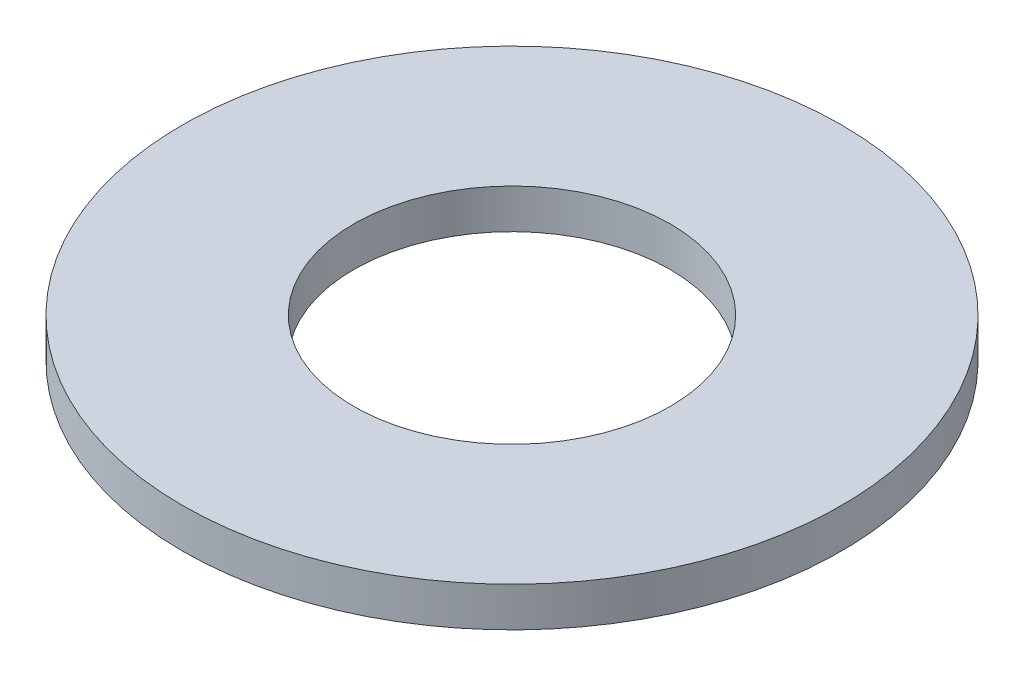
ISO-10303-21;
HEADER;
FILE_DESCRIPTION(('STEP AP214'),'2;1');
FILE_NAME('part.step','',(''),(''),'','','');
FILE_SCHEMA(('AUTOMOTIVE_DESIGN { 1 0 10303 214 1 1 1 1 }'));
ENDSEC;
DATA;
#1=APPLICATION_CONTEXT('core data for automotive mechanical design processes');
#2=APPLICATION_PROTOCOL_DEFINITION('international standard','automotive_design',2000,#1);
#3=PRODUCT_CONTEXT('',#1,'mechanical');
#4=PRODUCT('Part','Part','',(#3));
#5=PRODUCT_RELATED_PRODUCT_CATEGORY('part','',(#4));
#6=PRODUCT_DEFINITION_FORMATION('','',#4);
#7=PRODUCT_DEFINITION_CONTEXT('part definition',#1,'design');
#8=PRODUCT_DEFINITION('design','',#6,#7);
#9=PRODUCT_DEFINITION_SHAPE('','',#8);
#10=(LENGTH_UNIT() NAMED_UNIT(*) SI_UNIT(.MILLI.,.METRE.));
#11=(NAMED_UNIT(*) PLANE_ANGLE_UNIT() SI_UNIT($,.RADIAN.));
#12=(NAMED_UNIT(*) SI_UNIT($,.STERADIAN.) SOLID_ANGLE_UNIT());
#13=UNCERTAINTY_MEASURE_WITH_UNIT(LENGTH_MEASURE(1.E-05),#10,'distance_accuracy_value','');
#14=(GEOMETRIC_REPRESENTATION_CONTEXT(3) GLOBAL_UNCERTAINTY_ASSIGNED_CONTEXT((#13)) GLOBAL_UNIT_ASSIGNED_CONTEXT((#10,
#11,#12)) REPRESENTATION_CONTEXT('',''));
#15=CARTESIAN_POINT('',(0.,0.,0.));
#16=DIRECTION('',(0.,0.,1.));
#17=DIRECTION('',(1.,0.,0.));
#18=AXIS2_PLACEMENT_3D('',#15,#16,#17);
#19=CARTESIAN_POINT('',(0.,0.,0.));
#20=DIRECTION('',(0.,-1.,0.));
#21=DIRECTION('',(0.,0.,-1.));
#22=AXIS2_PLACEMENT_3D('',#19,#20,#21);
#23=CYLINDRICAL_SURFACE('',#22,1.2);
#24=CARTESIAN_POINT('',(0.,8.94450704225353,0.));
#25=DIRECTION('',(0.,-1.,0.));
#26=DIRECTION('',(0.,0.,-1.));
#27=AXIS2_PLACEMENT_3D('',#24,#25,#26);
#28=CIRCLE('',#27,1.2);
#29=CARTESIAN_POINT('',(0.,8.94450704225353,-1.2));
#30=VERTEX_POINT('',#29);
#31=EDGE_CURVE('E10',#30,#30,#28,.T.);
#32=ORIENTED_EDGE('',*,*,#31,.F.);
#33=EDGE_LOOP('',(#32));
#34=FACE_BOUND('',#33,.T.);
#35=CARTESIAN_POINT('',(0.,8.64450704225353,0.));
#36=DIRECTION('',(0.,-1.,0.));
#37=DIRECTION('',(0.,0.,-1.));
#38=AXIS2_PLACEMENT_3D('',#35,#36,#37);
#39=CIRCLE('',#38,1.2);
#40=CARTESIAN_POINT('',(0.,8.64450704225353,-1.2));
#41=VERTEX_POINT('',#40);
#42=EDGE_CURVE('E52',#41,#41,#39,.T.);
#43=ORIENTED_EDGE('',*,*,#42,.T.);
#44=EDGE_LOOP('',(#43));
#45=FACE_BOUND('',#44,.T.);
#46=ADVANCED_FACE('F34',(#34,#45),#23,.F.);
#47=CARTESIAN_POINT('',(-1.2,8.94450704225353,0.));
#48=DIRECTION('',(0.,-1.,0.));
#49=DIRECTION('',(0.,0.,-1.));
#50=AXIS2_PLACEMENT_3D('',#47,#48,#49);
#51=PLANE('',#50);
#52=CARTESIAN_POINT('',(0.,8.94450704225353,0.));
#53=DIRECTION('',(0.,-1.,0.));
#54=DIRECTION('',(0.,0.,-1.));
#55=AXIS2_PLACEMENT_3D('',#52,#53,#54);
#56=CIRCLE('',#55,2.5);
#57=CARTESIAN_POINT('',(0.,8.94450704225353,-2.5));
#58=VERTEX_POINT('',#57);
#59=EDGE_CURVE('E40',#58,#58,#56,.T.);
#60=ORIENTED_EDGE('',*,*,#59,.F.);
#61=EDGE_LOOP('',(#60));
#62=FACE_BOUND('',#61,.T.);
#63=ORIENTED_EDGE('',*,*,#31,.T.);
#64=EDGE_LOOP('',(#63));
#65=FACE_BOUND('',#64,.T.);
#66=ADVANCED_FACE('F69',(#62,#65),#51,.F.);
#67=CARTESIAN_POINT('',(0.,0.,0.));
#68=DIRECTION('',(0.,-1.,0.));
#69=DIRECTION('',(0.,0.,-1.));
#70=AXIS2_PLACEMENT_3D('',#67,#68,#69);
#71=CYLINDRICAL_SURFACE('',#70,2.5);
#72=CARTESIAN_POINT('',(0.,8.64450704225353,0.));
#73=DIRECTION('',(0.,-1.,0.));
#74=DIRECTION('',(0.,0.,-1.));
#75=AXIS2_PLACEMENT_3D('',#72,#73,#74);
#76=CIRCLE('',#75,2.5);
#77=CARTESIAN_POINT('',(0.,8.64450704225353,-2.5));
#78=VERTEX_POINT('',#77);
#79=EDGE_CURVE('E45',#78,#78,#76,.T.);
#80=ORIENTED_EDGE('',*,*,#79,.F.);
#81=EDGE_LOOP('',(#80));
#82=FACE_BOUND('',#81,.T.);
#83=ORIENTED_EDGE('',*,*,#59,.T.);
#84=EDGE_LOOP('',(#83));
#85=FACE_BOUND('',#84,.T.);
#86=ADVANCED_FACE('F64',(#82,#85),#71,.T.);
#87=CARTESIAN_POINT('',(-1.2,8.64450704225353,0.));
#88=DIRECTION('',(0.,1.,0.));
#89=DIRECTION('',(0.,0.,1.));
#90=AXIS2_PLACEMENT_3D('',#87,#88,#89);
#91=PLANE('',#90);
#92=ORIENTED_EDGE('',*,*,#42,.F.);
#93=EDGE_LOOP('',(#92));
#94=FACE_BOUND('',#93,.T.);
#95=ORIENTED_EDGE('',*,*,#79,.T.);
#96=EDGE_LOOP('',(#95));
#97=FACE_BOUND('',#96,.T.);
#98=ADVANCED_FACE('F61',(#94,#97),#91,.F.);
#99=CLOSED_SHELL('',(#46,#66,#86,#98));
#100=MANIFOLD_SOLID_BREP('B2',#99);
#101=ADVANCED_BREP_SHAPE_REPRESENTATION('',(#18,#100),#14);
#102=SHAPE_DEFINITION_REPRESENTATION(#9,#101);
ENDSEC;
END-ISO-10303-21;
